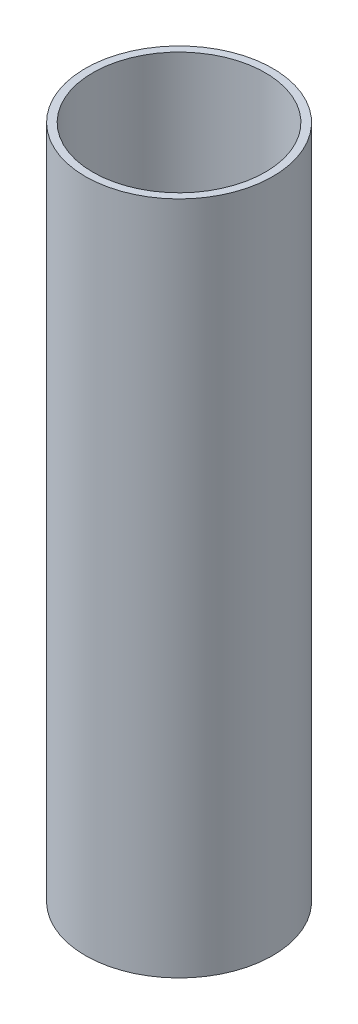
ISO-10303-21;
HEADER;
FILE_DESCRIPTION(('STEP AP214'),'2;1');
FILE_NAME('part.step','',(''),(''),'','','');
FILE_SCHEMA(('AUTOMOTIVE_DESIGN { 1 0 10303 214 1 1 1 1 }'));
ENDSEC;
DATA;
#1=APPLICATION_CONTEXT('core data for automotive mechanical design processes');
#2=APPLICATION_PROTOCOL_DEFINITION('international standard','automotive_design',2000,#1);
#3=PRODUCT_CONTEXT('',#1,'mechanical');
#4=PRODUCT('Part','Part','',(#3));
#5=PRODUCT_RELATED_PRODUCT_CATEGORY('part','',(#4));
#6=PRODUCT_DEFINITION_FORMATION('','',#4);
#7=PRODUCT_DEFINITION_CONTEXT('part definition',#1,'design');
#8=PRODUCT_DEFINITION('design','',#6,#7);
#9=PRODUCT_DEFINITION_SHAPE('','',#8);
#10=(LENGTH_UNIT() NAMED_UNIT(*) SI_UNIT(.MILLI.,.METRE.));
#11=(NAMED_UNIT(*) PLANE_ANGLE_UNIT() SI_UNIT($,.RADIAN.));
#12=(NAMED_UNIT(*) SI_UNIT($,.STERADIAN.) SOLID_ANGLE_UNIT());
#13=UNCERTAINTY_MEASURE_WITH_UNIT(LENGTH_MEASURE(1.E-05),#10,'distance_accuracy_value','');
#14=(GEOMETRIC_REPRESENTATION_CONTEXT(3) GLOBAL_UNCERTAINTY_ASSIGNED_CONTEXT((#13)) GLOBAL_UNIT_ASSIGNED_CONTEXT((#10,
#11,#12)) REPRESENTATION_CONTEXT('',''));
#15=CARTESIAN_POINT('',(0.,0.,0.));
#16=DIRECTION('',(0.,0.,1.));
#17=DIRECTION('',(1.,0.,0.));
#18=AXIS2_PLACEMENT_3D('',#15,#16,#17);
#19=CARTESIAN_POINT('',(0.,114.3,0.));
#20=DIRECTION('',(0.,1.,0.));
#21=DIRECTION('',(0.,0.,1.));
#22=AXIS2_PLACEMENT_3D('',#19,#20,#21);
#23=PLANE('',#22);
#24=CARTESIAN_POINT('',(0.,114.3,0.));
#25=DIRECTION('',(0.,1.,0.));
#26=DIRECTION('',(0.,0.,1.));
#27=AXIS2_PLACEMENT_3D('',#24,#25,#26);
#28=CIRCLE('',#27,15.875);
#29=CARTESIAN_POINT('',(0.,114.3,15.875));
#30=VERTEX_POINT('',#29);
#31=EDGE_CURVE('E10',#30,#30,#28,.T.);
#32=ORIENTED_EDGE('',*,*,#31,.T.);
#33=EDGE_LOOP('',(#32));
#34=FACE_BOUND('',#33,.T.);
#35=CARTESIAN_POINT('',(0.,114.3,0.));
#36=DIRECTION('',(0.,1.,0.));
#37=DIRECTION('',(0.,0.,1.));
#38=AXIS2_PLACEMENT_3D('',#35,#36,#37);
#39=CIRCLE('',#38,14.605);
#40=CARTESIAN_POINT('',(0.,114.3,14.605));
#41=VERTEX_POINT('',#40);
#42=EDGE_CURVE('E52',#41,#41,#39,.T.);
#43=ORIENTED_EDGE('',*,*,#42,.F.);
#44=EDGE_LOOP('',(#43));
#45=FACE_BOUND('',#44,.T.);
#46=ADVANCED_FACE('F41',(#34,#45),#23,.T.);
#47=CARTESIAN_POINT('',(0.,0.,0.));
#48=DIRECTION('',(0.,1.,0.));
#49=DIRECTION('',(0.,0.,1.));
#50=AXIS2_PLACEMENT_3D('',#47,#48,#49);
#51=PLANE('',#50);
#52=CARTESIAN_POINT('',(0.,0.,0.));
#53=DIRECTION('',(0.,1.,0.));
#54=DIRECTION('',(0.,0.,1.));
#55=AXIS2_PLACEMENT_3D('',#52,#53,#54);
#56=CIRCLE('',#55,15.875);
#57=CARTESIAN_POINT('',(0.,0.,15.875));
#58=VERTEX_POINT('',#57);
#59=EDGE_CURVE('E45',#58,#58,#56,.T.);
#60=ORIENTED_EDGE('',*,*,#59,.F.);
#61=EDGE_LOOP('',(#60));
#62=FACE_BOUND('',#61,.T.);
#63=CARTESIAN_POINT('',(0.,0.,0.));
#64=DIRECTION('',(0.,1.,0.));
#65=DIRECTION('',(0.,0.,1.));
#66=AXIS2_PLACEMENT_3D('',#63,#64,#65);
#67=CIRCLE('',#66,14.605);
#68=CARTESIAN_POINT('',(0.,0.,14.605));
#69=VERTEX_POINT('',#68);
#70=EDGE_CURVE('E54',#69,#69,#67,.T.);
#71=ORIENTED_EDGE('',*,*,#70,.T.);
#72=EDGE_LOOP('',(#71));
#73=FACE_BOUND('',#72,.T.);
#74=ADVANCED_FACE('F64',(#62,#73),#51,.F.);
#75=CARTESIAN_POINT('',(0.,114.3,0.));
#76=DIRECTION('',(0.,-1.,0.));
#77=DIRECTION('',(0.,0.,-1.));
#78=AXIS2_PLACEMENT_3D('',#75,#76,#77);
#79=CYLINDRICAL_SURFACE('',#78,15.875);
#80=ORIENTED_EDGE('',*,*,#31,.F.);
#81=EDGE_LOOP('',(#80));
#82=FACE_BOUND('',#81,.T.);
#83=ORIENTED_EDGE('',*,*,#59,.T.);
#84=EDGE_LOOP('',(#83));
#85=FACE_BOUND('',#84,.T.);
#86=ADVANCED_FACE('F43',(#82,#85),#79,.T.);
#87=CARTESIAN_POINT('',(0.,114.3,0.));
#88=DIRECTION('',(0.,-1.,0.));
#89=DIRECTION('',(0.,0.,-1.));
#90=AXIS2_PLACEMENT_3D('',#87,#88,#89);
#91=CYLINDRICAL_SURFACE('',#90,14.605);
#92=ORIENTED_EDGE('',*,*,#42,.T.);
#93=EDGE_LOOP('',(#92));
#94=FACE_BOUND('',#93,.T.);
#95=ORIENTED_EDGE('',*,*,#70,.F.);
#96=EDGE_LOOP('',(#95));
#97=FACE_BOUND('',#96,.T.);
#98=ADVANCED_FACE('F60',(#94,#97),#91,.F.);
#99=CLOSED_SHELL('',(#46,#74,#86,#98));
#100=MANIFOLD_SOLID_BREP('B2',#99);
#101=ADVANCED_BREP_SHAPE_REPRESENTATION('',(#18,#100),#14);
#102=SHAPE_DEFINITION_REPRESENTATION(#9,#101);
ENDSEC;
END-ISO-10303-21;
